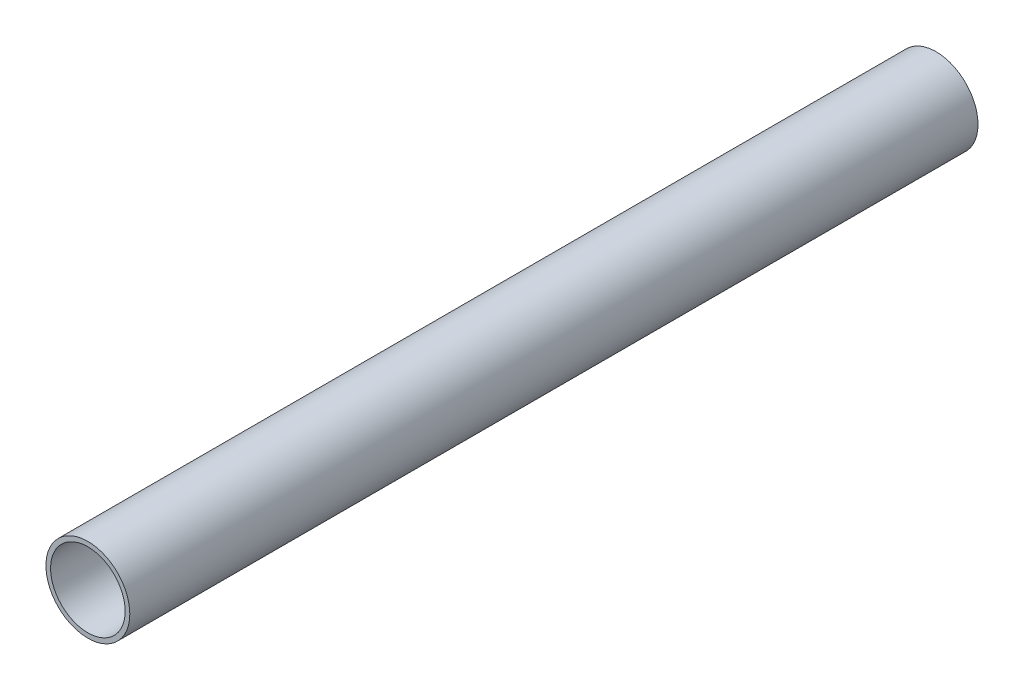
ISO-10303-21;
HEADER;
FILE_DESCRIPTION(('STEP AP214'),'2;1');
FILE_NAME('part.step','',(''),(''),'','','');
FILE_SCHEMA(('AUTOMOTIVE_DESIGN { 1 0 10303 214 1 1 1 1 }'));
ENDSEC;
DATA;
#1=APPLICATION_CONTEXT('core data for automotive mechanical design processes');
#2=APPLICATION_PROTOCOL_DEFINITION('international standard','automotive_design',2000,#1);
#3=PRODUCT_CONTEXT('',#1,'mechanical');
#4=PRODUCT('Part','Part','',(#3));
#5=PRODUCT_RELATED_PRODUCT_CATEGORY('part','',(#4));
#6=PRODUCT_DEFINITION_FORMATION('','',#4);
#7=PRODUCT_DEFINITION_CONTEXT('part definition',#1,'design');
#8=PRODUCT_DEFINITION('design','',#6,#7);
#9=PRODUCT_DEFINITION_SHAPE('','',#8);
#10=(LENGTH_UNIT() NAMED_UNIT(*) SI_UNIT(.MILLI.,.METRE.));
#11=(NAMED_UNIT(*) PLANE_ANGLE_UNIT() SI_UNIT($,.RADIAN.));
#12=(NAMED_UNIT(*) SI_UNIT($,.STERADIAN.) SOLID_ANGLE_UNIT());
#13=UNCERTAINTY_MEASURE_WITH_UNIT(LENGTH_MEASURE(1.E-05),#10,'distance_accuracy_value','');
#14=(GEOMETRIC_REPRESENTATION_CONTEXT(3) GLOBAL_UNCERTAINTY_ASSIGNED_CONTEXT((#13)) GLOBAL_UNIT_ASSIGNED_CONTEXT((#10,
#11,#12)) REPRESENTATION_CONTEXT('',''));
#15=CARTESIAN_POINT('',(0.,0.,0.));
#16=DIRECTION('',(0.,0.,1.));
#17=DIRECTION('',(1.,0.,0.));
#18=AXIS2_PLACEMENT_3D('',#15,#16,#17);
#19=CARTESIAN_POINT('',(0.,0.,91.));
#20=DIRECTION('',(0.,0.,1.));
#21=DIRECTION('',(1.,0.,0.));
#22=AXIS2_PLACEMENT_3D('',#19,#20,#21);
#23=PLANE('',#22);
#24=CARTESIAN_POINT('',(0.,0.,91.));
#25=DIRECTION('',(0.,0.,1.));
#26=DIRECTION('',(1.,0.,0.));
#27=AXIS2_PLACEMENT_3D('',#24,#25,#26);
#28=CIRCLE('',#27,9.);
#29=CARTESIAN_POINT('',(9.,0.,91.));
#30=VERTEX_POINT('',#29);
#31=EDGE_CURVE('E10',#30,#30,#28,.T.);
#32=ORIENTED_EDGE('',*,*,#31,.T.);
#33=EDGE_LOOP('',(#32));
#34=FACE_BOUND('',#33,.T.);
#35=CARTESIAN_POINT('',(0.,0.,91.));
#36=DIRECTION('',(0.,0.,1.));
#37=DIRECTION('',(1.,0.,0.));
#38=AXIS2_PLACEMENT_3D('',#35,#36,#37);
#39=CIRCLE('',#38,8.);
#40=CARTESIAN_POINT('',(8.,0.,91.));
#41=VERTEX_POINT('',#40);
#42=EDGE_CURVE('E50',#41,#41,#39,.T.);
#43=ORIENTED_EDGE('',*,*,#42,.F.);
#44=EDGE_LOOP('',(#43));
#45=FACE_BOUND('',#44,.T.);
#46=ADVANCED_FACE('F39',(#34,#45),#23,.T.);
#47=CARTESIAN_POINT('',(0.,0.,-91.));
#48=DIRECTION('',(0.,0.,1.));
#49=DIRECTION('',(1.,0.,0.));
#50=AXIS2_PLACEMENT_3D('',#47,#48,#49);
#51=PLANE('',#50);
#52=CARTESIAN_POINT('',(0.,0.,-91.));
#53=DIRECTION('',(0.,0.,1.));
#54=DIRECTION('',(1.,0.,0.));
#55=AXIS2_PLACEMENT_3D('',#52,#53,#54);
#56=CIRCLE('',#55,9.);
#57=CARTESIAN_POINT('',(9.,0.,-91.));
#58=VERTEX_POINT('',#57);
#59=EDGE_CURVE('E43',#58,#58,#56,.T.);
#60=ORIENTED_EDGE('',*,*,#59,.F.);
#61=EDGE_LOOP('',(#60));
#62=FACE_BOUND('',#61,.T.);
#63=CARTESIAN_POINT('',(0.,0.,-91.));
#64=DIRECTION('',(0.,0.,1.));
#65=DIRECTION('',(1.,0.,0.));
#66=AXIS2_PLACEMENT_3D('',#63,#64,#65);
#67=CIRCLE('',#66,8.);
#68=CARTESIAN_POINT('',(8.,0.,-91.));
#69=VERTEX_POINT('',#68);
#70=EDGE_CURVE('E52',#69,#69,#67,.T.);
#71=ORIENTED_EDGE('',*,*,#70,.T.);
#72=EDGE_LOOP('',(#71));
#73=FACE_BOUND('',#72,.T.);
#74=ADVANCED_FACE('F62',(#62,#73),#51,.F.);
#75=CARTESIAN_POINT('',(0.,0.,91.));
#76=DIRECTION('',(0.,0.,-1.));
#77=DIRECTION('',(-1.,0.,0.));
#78=AXIS2_PLACEMENT_3D('',#75,#76,#77);
#79=CYLINDRICAL_SURFACE('',#78,9.);
#80=ORIENTED_EDGE('',*,*,#31,.F.);
#81=EDGE_LOOP('',(#80));
#82=FACE_BOUND('',#81,.T.);
#83=ORIENTED_EDGE('',*,*,#59,.T.);
#84=EDGE_LOOP('',(#83));
#85=FACE_BOUND('',#84,.T.);
#86=ADVANCED_FACE('F41',(#82,#85),#79,.T.);
#87=CARTESIAN_POINT('',(0.,0.,91.));
#88=DIRECTION('',(0.,0.,-1.));
#89=DIRECTION('',(-1.,0.,0.));
#90=AXIS2_PLACEMENT_3D('',#87,#88,#89);
#91=CYLINDRICAL_SURFACE('',#90,8.);
#92=ORIENTED_EDGE('',*,*,#42,.T.);
#93=EDGE_LOOP('',(#92));
#94=FACE_BOUND('',#93,.T.);
#95=ORIENTED_EDGE('',*,*,#70,.F.);
#96=EDGE_LOOP('',(#95));
#97=FACE_BOUND('',#96,.T.);
#98=ADVANCED_FACE('F58',(#94,#97),#91,.F.);
#99=CLOSED_SHELL('',(#46,#74,#86,#98));
#100=MANIFOLD_SOLID_BREP('B2',#99);
#101=ADVANCED_BREP_SHAPE_REPRESENTATION('',(#18,#100),#14);
#102=SHAPE_DEFINITION_REPRESENTATION(#9,#101);
ENDSEC;
END-ISO-10303-21;
